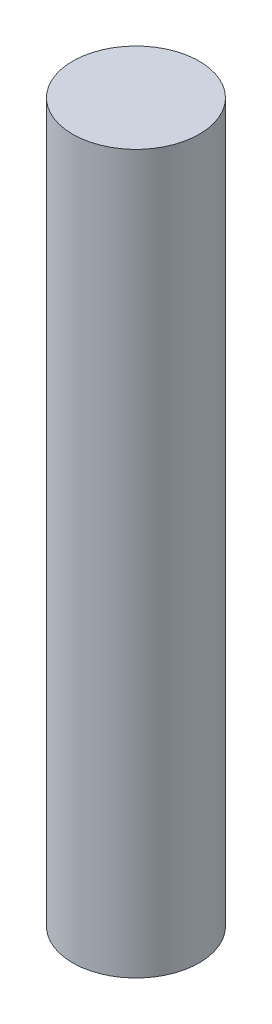
ISO-10303-21;
HEADER;
FILE_DESCRIPTION(('STEP AP214'),'2;1');
FILE_NAME('part.step','',(''),(''),'','','');
FILE_SCHEMA(('AUTOMOTIVE_DESIGN { 1 0 10303 214 1 1 1 1 }'));
ENDSEC;
DATA;
#1=APPLICATION_CONTEXT('core data for automotive mechanical design processes');
#2=APPLICATION_PROTOCOL_DEFINITION('international standard','automotive_design',2000,#1);
#3=PRODUCT_CONTEXT('',#1,'mechanical');
#4=PRODUCT('Part','Part','',(#3));
#5=PRODUCT_RELATED_PRODUCT_CATEGORY('part','',(#4));
#6=PRODUCT_DEFINITION_FORMATION('','',#4);
#7=PRODUCT_DEFINITION_CONTEXT('part definition',#1,'design');
#8=PRODUCT_DEFINITION('design','',#6,#7);
#9=PRODUCT_DEFINITION_SHAPE('','',#8);
#10=(LENGTH_UNIT() NAMED_UNIT(*) SI_UNIT(.MILLI.,.METRE.));
#11=(NAMED_UNIT(*) PLANE_ANGLE_UNIT() SI_UNIT($,.RADIAN.));
#12=(NAMED_UNIT(*) SI_UNIT($,.STERADIAN.) SOLID_ANGLE_UNIT());
#13=UNCERTAINTY_MEASURE_WITH_UNIT(LENGTH_MEASURE(1.E-05),#10,'distance_accuracy_value','');
#14=(GEOMETRIC_REPRESENTATION_CONTEXT(3) GLOBAL_UNCERTAINTY_ASSIGNED_CONTEXT((#13)) GLOBAL_UNIT_ASSIGNED_CONTEXT((#10,
#11,#12)) REPRESENTATION_CONTEXT('',''));
#15=CARTESIAN_POINT('',(0.,0.,0.));
#16=DIRECTION('',(0.,0.,1.));
#17=DIRECTION('',(1.,0.,0.));
#18=AXIS2_PLACEMENT_3D('',#15,#16,#17);
#19=CARTESIAN_POINT('',(0.,17.,0.));
#20=DIRECTION('',(0.,-1.,0.));
#21=DIRECTION('',(0.,0.,-1.));
#22=AXIS2_PLACEMENT_3D('',#19,#20,#21);
#23=CYLINDRICAL_SURFACE('',#22,1.5);
#24=CARTESIAN_POINT('',(0.,17.,0.));
#25=DIRECTION('',(0.,1.,0.));
#26=DIRECTION('',(0.,0.,1.));
#27=AXIS2_PLACEMENT_3D('',#24,#25,#26);
#28=CIRCLE('',#27,1.5);
#29=CARTESIAN_POINT('',(0.,17.,1.5));
#30=VERTEX_POINT('',#29);
#31=EDGE_CURVE('E10',#30,#30,#28,.T.);
#32=ORIENTED_EDGE('',*,*,#31,.F.);
#33=EDGE_LOOP('',(#32));
#34=FACE_BOUND('',#33,.T.);
#35=CARTESIAN_POINT('',(0.,0.,0.));
#36=DIRECTION('',(0.,1.,0.));
#37=DIRECTION('',(0.,0.,1.));
#38=AXIS2_PLACEMENT_3D('',#35,#36,#37);
#39=CIRCLE('',#38,1.5);
#40=CARTESIAN_POINT('',(0.,0.,1.5));
#41=VERTEX_POINT('',#40);
#42=EDGE_CURVE('E34',#41,#41,#39,.T.);
#43=ORIENTED_EDGE('',*,*,#42,.T.);
#44=EDGE_LOOP('',(#43));
#45=FACE_BOUND('',#44,.T.);
#46=ADVANCED_FACE('F31',(#34,#45),#23,.T.);
#47=CARTESIAN_POINT('',(0.,17.,0.));
#48=DIRECTION('',(0.,1.,0.));
#49=DIRECTION('',(0.,0.,1.));
#50=AXIS2_PLACEMENT_3D('',#47,#48,#49);
#51=PLANE('',#50);
#52=ORIENTED_EDGE('',*,*,#31,.T.);
#53=EDGE_LOOP('',(#52));
#54=FACE_BOUND('',#53,.T.);
#55=ADVANCED_FACE('F46',(#54),#51,.T.);
#56=CARTESIAN_POINT('',(0.,0.,0.));
#57=DIRECTION('',(0.,1.,0.));
#58=DIRECTION('',(0.,0.,1.));
#59=AXIS2_PLACEMENT_3D('',#56,#57,#58);
#60=PLANE('',#59);
#61=ORIENTED_EDGE('',*,*,#42,.F.);
#62=EDGE_LOOP('',(#61));
#63=FACE_BOUND('',#62,.T.);
#64=ADVANCED_FACE('F44',(#63),#60,.F.);
#65=CLOSED_SHELL('',(#46,#55,#64));
#66=MANIFOLD_SOLID_BREP('B2',#65);
#67=ADVANCED_BREP_SHAPE_REPRESENTATION('',(#18,#66),#14);
#68=SHAPE_DEFINITION_REPRESENTATION(#9,#67);
ENDSEC;
END-ISO-10303-21;
